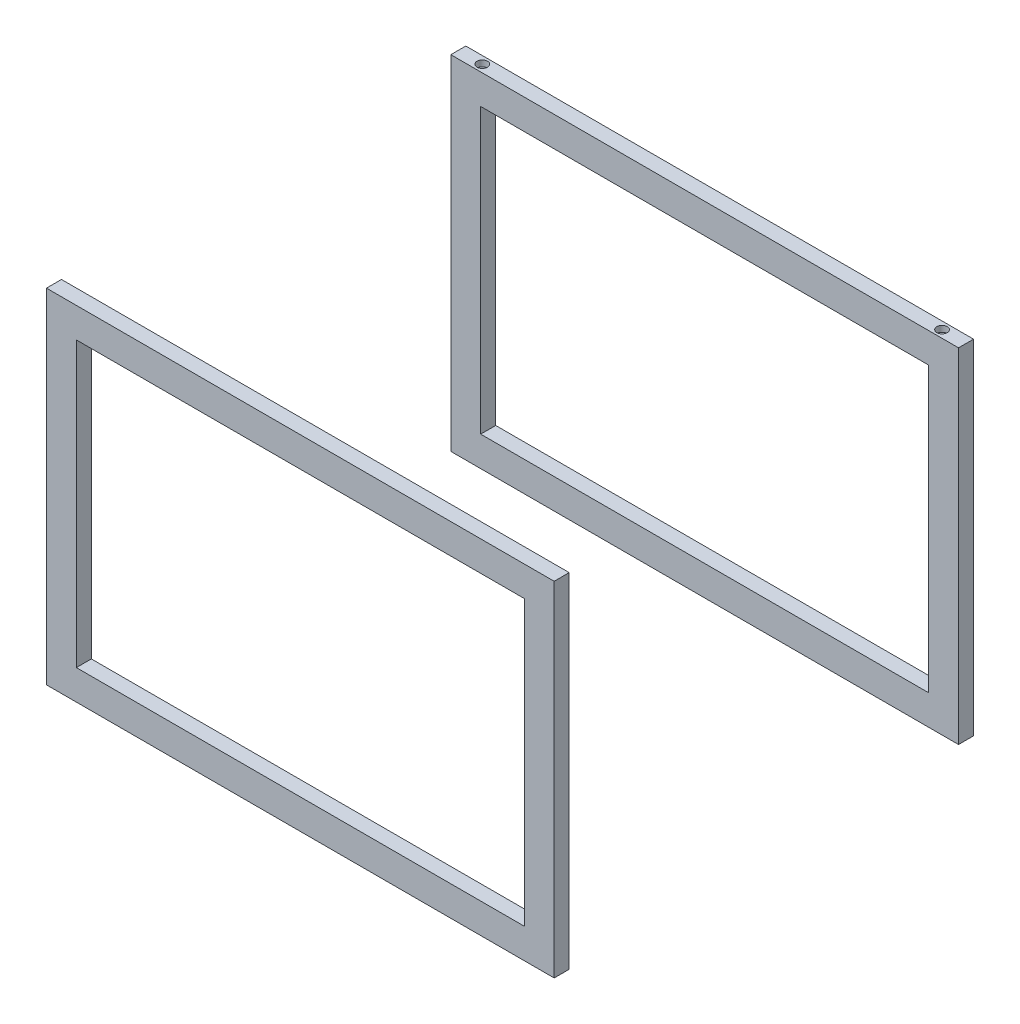
ISO-10303-21;
HEADER;
FILE_DESCRIPTION(('STEP AP214'),'2;1');
FILE_NAME('part.step','',(''),(''),'','','');
FILE_SCHEMA(('AUTOMOTIVE_DESIGN { 1 0 10303 214 1 1 1 1 }'));
ENDSEC;
DATA;
#1=APPLICATION_CONTEXT('core data for automotive mechanical design processes');
#2=APPLICATION_PROTOCOL_DEFINITION('international standard','automotive_design',2000,#1);
#3=PRODUCT_CONTEXT('',#1,'mechanical');
#4=PRODUCT('Part','Part','',(#3));
#5=PRODUCT_RELATED_PRODUCT_CATEGORY('part','',(#4));
#6=PRODUCT_DEFINITION_FORMATION('','',#4);
#7=PRODUCT_DEFINITION_CONTEXT('part definition',#1,'design');
#8=PRODUCT_DEFINITION('design','',#6,#7);
#9=PRODUCT_DEFINITION_SHAPE('','',#8);
#10=(LENGTH_UNIT() NAMED_UNIT(*) SI_UNIT(.MILLI.,.METRE.));
#11=(NAMED_UNIT(*) PLANE_ANGLE_UNIT() SI_UNIT($,.RADIAN.));
#12=(NAMED_UNIT(*) SI_UNIT($,.STERADIAN.) SOLID_ANGLE_UNIT());
#13=UNCERTAINTY_MEASURE_WITH_UNIT(LENGTH_MEASURE(1.E-05),#10,'distance_accuracy_value','');
#14=(GEOMETRIC_REPRESENTATION_CONTEXT(3) GLOBAL_UNCERTAINTY_ASSIGNED_CONTEXT((#13)) GLOBAL_UNIT_ASSIGNED_CONTEXT((#10,
#11,#12)) REPRESENTATION_CONTEXT('',''));
#15=CARTESIAN_POINT('',(0.,0.,0.));
#16=DIRECTION('',(0.,0.,1.));
#17=DIRECTION('',(1.,0.,0.));
#18=AXIS2_PLACEMENT_3D('',#15,#16,#17);
#19=CARTESIAN_POINT('',(99.8100000000002,0.,1349.87));
#20=DIRECTION('',(-1.,0.,0.));
#21=DIRECTION('',(0.,-1.,0.));
#22=AXIS2_PLACEMENT_3D('',#19,#20,#21);
#23=PLANE('',#22);
#24=DIRECTION('',(0.,-1.,0.));
#25=VECTOR('',#24,1.);
#26=CARTESIAN_POINT('',(99.8100000000002,0.,1400.));
#27=LINE('',#26,#25);
#28=CARTESIAN_POINT('',(99.8100000000002,1047.19,1400.));
#29=VERTEX_POINT('',#28);
#30=CARTESIAN_POINT('',(99.8100000000001,99.81,1400.));
#31=VERTEX_POINT('',#30);
#32=EDGE_CURVE('E168',#29,#31,#27,.T.);
#33=ORIENTED_EDGE('',*,*,#32,.T.);
#34=DIRECTION('',(0.,0.,1.));
#35=VECTOR('',#34,1.);
#36=CARTESIAN_POINT('',(99.8100000000001,99.81,1349.87));
#37=LINE('',#36,#35);
#38=CARTESIAN_POINT('',(99.8100000000001,99.81,1349.87));
#39=VERTEX_POINT('',#38);
#40=EDGE_CURVE('E12',#39,#31,#37,.T.);
#41=ORIENTED_EDGE('',*,*,#40,.F.);
#42=DIRECTION('',(0.,-1.,0.));
#43=VECTOR('',#42,1.);
#44=CARTESIAN_POINT('',(99.81,0.,1349.87));
#45=LINE('',#44,#43);
#46=CARTESIAN_POINT('',(99.8100000000002,1047.19,1349.87));
#47=VERTEX_POINT('',#46);
#48=EDGE_CURVE('E142',#47,#39,#45,.T.);
#49=ORIENTED_EDGE('',*,*,#48,.F.);
#50=DIRECTION('',(0.,0.,1.));
#51=VECTOR('',#50,1.);
#52=CARTESIAN_POINT('',(99.8100000000002,1047.19,1349.87));
#53=LINE('',#52,#51);
#54=EDGE_CURVE('E134',#47,#29,#53,.T.);
#55=ORIENTED_EDGE('',*,*,#54,.T.);
#56=EDGE_LOOP('',(#33,#41,#49,#55));
#57=FACE_BOUND('',#56,.T.);
#58=ADVANCED_FACE('F53',(#57),#23,.F.);
#59=CARTESIAN_POINT('',(0.,99.81,1349.87));
#60=DIRECTION('',(0.,1.,0.));
#61=DIRECTION('',(0.,0.,1.));
#62=AXIS2_PLACEMENT_3D('',#59,#60,#61);
#63=PLANE('',#62);
#64=DIRECTION('',(-1.,0.,0.));
#65=VECTOR('',#64,1.);
#66=CARTESIAN_POINT('',(0.,99.81,1400.));
#67=LINE('',#66,#65);
#68=CARTESIAN_POINT('',(1595.19,99.81,1400.));
#69=VERTEX_POINT('',#68);
#70=EDGE_CURVE('E97',#69,#31,#67,.T.);
#71=ORIENTED_EDGE('',*,*,#70,.F.);
#72=DIRECTION('',(0.,0.,1.));
#73=VECTOR('',#72,1.);
#74=CARTESIAN_POINT('',(1595.19,99.81,1349.87));
#75=LINE('',#74,#73);
#76=CARTESIAN_POINT('',(1595.19,99.81,1349.87));
#77=VERTEX_POINT('',#76);
#78=EDGE_CURVE('E63',#77,#69,#75,.T.);
#79=ORIENTED_EDGE('',*,*,#78,.F.);
#80=DIRECTION('',(-1.,0.,0.));
#81=VECTOR('',#80,1.);
#82=CARTESIAN_POINT('',(0.,99.81,1349.87));
#83=LINE('',#82,#81);
#84=EDGE_CURVE('E71',#77,#39,#83,.T.);
#85=ORIENTED_EDGE('',*,*,#84,.T.);
#86=ORIENTED_EDGE('',*,*,#40,.T.);
#87=EDGE_LOOP('',(#71,#79,#85,#86));
#88=FACE_BOUND('',#87,.T.);
#89=ADVANCED_FACE('F209',(#88),#63,.T.);
#90=CARTESIAN_POINT('',(0.,1047.19,1349.87));
#91=DIRECTION('',(0.,1.,0.));
#92=DIRECTION('',(0.,0.,1.));
#93=AXIS2_PLACEMENT_3D('',#90,#91,#92);
#94=PLANE('',#93);
#95=DIRECTION('',(-1.,0.,0.));
#96=VECTOR('',#95,1.);
#97=CARTESIAN_POINT('',(0.,1047.19,1400.));
#98=LINE('',#97,#96);
#99=CARTESIAN_POINT('',(1595.19,1047.19,1400.));
#100=VERTEX_POINT('',#99);
#101=EDGE_CURVE('E165',#100,#29,#98,.T.);
#102=ORIENTED_EDGE('',*,*,#101,.T.);
#103=ORIENTED_EDGE('',*,*,#54,.F.);
#104=DIRECTION('',(-1.,0.,0.));
#105=VECTOR('',#104,1.);
#106=CARTESIAN_POINT('',(0.,1047.19,1349.87));
#107=LINE('',#106,#105);
#108=CARTESIAN_POINT('',(1595.19,1047.19,1349.87));
#109=VERTEX_POINT('',#108);
#110=EDGE_CURVE('E138',#109,#47,#107,.T.);
#111=ORIENTED_EDGE('',*,*,#110,.F.);
#112=DIRECTION('',(0.,0.,1.));
#113=VECTOR('',#112,1.);
#114=CARTESIAN_POINT('',(1595.19,1047.19,1349.87));
#115=LINE('',#114,#113);
#116=EDGE_CURVE('E124',#109,#100,#115,.T.);
#117=ORIENTED_EDGE('',*,*,#116,.T.);
#118=EDGE_LOOP('',(#102,#103,#111,#117));
#119=FACE_BOUND('',#118,.T.);
#120=ADVANCED_FACE('F139',(#119),#94,.F.);
#121=CARTESIAN_POINT('',(0.,0.,1349.87));
#122=DIRECTION('',(-1.,0.,0.));
#123=DIRECTION('',(0.,0.,1.));
#124=AXIS2_PLACEMENT_3D('',#121,#122,#123);
#125=PLANE('',#124);
#126=DIRECTION('',(0.,-1.,0.));
#127=VECTOR('',#126,1.);
#128=CARTESIAN_POINT('',(0.,0.,1400.));
#129=LINE('',#128,#127);
#130=CARTESIAN_POINT('',(0.,1147.,1400.));
#131=VERTEX_POINT('',#130);
#132=CARTESIAN_POINT('',(0.,0.,1400.));
#133=VERTEX_POINT('',#132);
#134=EDGE_CURVE('E153',#131,#133,#129,.T.);
#135=ORIENTED_EDGE('',*,*,#134,.F.);
#136=DIRECTION('',(0.,0.,1.));
#137=VECTOR('',#136,1.);
#138=CARTESIAN_POINT('',(0.,1147.,1349.87));
#139=LINE('',#138,#137);
#140=CARTESIAN_POINT('',(0.,1147.,1349.87));
#141=VERTEX_POINT('',#140);
#142=EDGE_CURVE('E57',#141,#131,#139,.T.);
#143=ORIENTED_EDGE('',*,*,#142,.F.);
#144=DIRECTION('',(0.,-1.,0.));
#145=VECTOR('',#144,1.);
#146=CARTESIAN_POINT('',(0.,0.,1349.87));
#147=LINE('',#146,#145);
#148=CARTESIAN_POINT('',(0.,0.,1349.87));
#149=VERTEX_POINT('',#148);
#150=EDGE_CURVE('E195',#141,#149,#147,.T.);
#151=ORIENTED_EDGE('',*,*,#150,.T.);
#152=DIRECTION('',(0.,0.,1.));
#153=VECTOR('',#152,1.);
#154=CARTESIAN_POINT('',(0.,0.,1349.87));
#155=LINE('',#154,#153);
#156=EDGE_CURVE('E147',#149,#133,#155,.T.);
#157=ORIENTED_EDGE('',*,*,#156,.T.);
#158=EDGE_LOOP('',(#135,#143,#151,#157));
#159=FACE_BOUND('',#158,.T.);
#160=ADVANCED_FACE('F55',(#159),#125,.T.);
#161=CARTESIAN_POINT('',(0.,1147.,1349.87));
#162=DIRECTION('',(0.,1.,0.));
#163=DIRECTION('',(0.,0.,1.));
#164=AXIS2_PLACEMENT_3D('',#161,#162,#163);
#165=PLANE('',#164);
#166=DIRECTION('',(-1.,0.,0.));
#167=VECTOR('',#166,1.);
#168=CARTESIAN_POINT('',(0.,1147.,1400.));
#169=LINE('',#168,#167);
#170=CARTESIAN_POINT('',(1695.,1147.,1400.));
#171=VERTEX_POINT('',#170);
#172=EDGE_CURVE('E156',#171,#131,#169,.T.);
#173=ORIENTED_EDGE('',*,*,#172,.F.);
#174=DIRECTION('',(0.,0.,1.));
#175=VECTOR('',#174,1.);
#176=CARTESIAN_POINT('',(1695.,1147.,1349.87));
#177=LINE('',#176,#175);
#178=CARTESIAN_POINT('',(1695.,1147.,1349.87));
#179=VERTEX_POINT('',#178);
#180=EDGE_CURVE('E174',#179,#171,#177,.T.);
#181=ORIENTED_EDGE('',*,*,#180,.F.);
#182=DIRECTION('',(-1.,0.,0.));
#183=VECTOR('',#182,1.);
#184=CARTESIAN_POINT('',(0.,1147.,1349.87));
#185=LINE('',#184,#183);
#186=EDGE_CURVE('E183',#179,#141,#185,.T.);
#187=ORIENTED_EDGE('',*,*,#186,.T.);
#188=ORIENTED_EDGE('',*,*,#142,.T.);
#189=EDGE_LOOP('',(#173,#181,#187,#188));
#190=FACE_BOUND('',#189,.T.);
#191=ADVANCED_FACE('F181',(#190),#165,.T.);
#192=CARTESIAN_POINT('',(1695.,0.,1349.87));
#193=DIRECTION('',(-1.,0.,0.));
#194=DIRECTION('',(0.,0.,1.));
#195=AXIS2_PLACEMENT_3D('',#192,#193,#194);
#196=PLANE('',#195);
#197=DIRECTION('',(0.,-1.,0.));
#198=VECTOR('',#197,1.);
#199=CARTESIAN_POINT('',(1695.,0.,1400.));
#200=LINE('',#199,#198);
#201=CARTESIAN_POINT('',(1695.,0.,1400.));
#202=VERTEX_POINT('',#201);
#203=EDGE_CURVE('E159',#171,#202,#200,.T.);
#204=ORIENTED_EDGE('',*,*,#203,.T.);
#205=DIRECTION('',(0.,0.,1.));
#206=VECTOR('',#205,1.);
#207=CARTESIAN_POINT('',(1695.,0.,1349.87));
#208=LINE('',#207,#206);
#209=CARTESIAN_POINT('',(1695.,0.,1349.87));
#210=VERTEX_POINT('',#209);
#211=EDGE_CURVE('E149',#210,#202,#208,.T.);
#212=ORIENTED_EDGE('',*,*,#211,.F.);
#213=DIRECTION('',(0.,-1.,0.));
#214=VECTOR('',#213,1.);
#215=CARTESIAN_POINT('',(1695.,0.,1349.87));
#216=LINE('',#215,#214);
#217=EDGE_CURVE('E190',#179,#210,#216,.T.);
#218=ORIENTED_EDGE('',*,*,#217,.F.);
#219=ORIENTED_EDGE('',*,*,#180,.T.);
#220=EDGE_LOOP('',(#204,#212,#218,#219));
#221=FACE_BOUND('',#220,.T.);
#222=ADVANCED_FACE('F188',(#221),#196,.F.);
#223=CARTESIAN_POINT('',(1595.19,9.07771427587485E-13,1349.87));
#224=DIRECTION('',(-1.,0.,0.));
#225=DIRECTION('',(0.,-1.,0.));
#226=AXIS2_PLACEMENT_3D('',#223,#224,#225);
#227=PLANE('',#226);
#228=DIRECTION('',(0.,-1.,0.));
#229=VECTOR('',#228,1.);
#230=CARTESIAN_POINT('',(1595.19,9.07771427587485E-13,1400.));
#231=LINE('',#230,#229);
#232=EDGE_CURVE('E130',#100,#69,#231,.T.);
#233=ORIENTED_EDGE('',*,*,#232,.F.);
#234=ORIENTED_EDGE('',*,*,#116,.F.);
#235=DIRECTION('',(0.,-1.,0.));
#236=VECTOR('',#235,1.);
#237=CARTESIAN_POINT('',(1595.19,0.,1349.87));
#238=LINE('',#237,#236);
#239=EDGE_CURVE('E128',#109,#77,#238,.T.);
#240=ORIENTED_EDGE('',*,*,#239,.T.);
#241=ORIENTED_EDGE('',*,*,#78,.T.);
#242=EDGE_LOOP('',(#233,#234,#240,#241));
#243=FACE_BOUND('',#242,.T.);
#244=ADVANCED_FACE('F126',(#243),#227,.T.);
#245=CARTESIAN_POINT('',(0.,0.,1349.87));
#246=DIRECTION('',(0.,1.,0.));
#247=DIRECTION('',(0.,0.,1.));
#248=AXIS2_PLACEMENT_3D('',#245,#246,#247);
#249=PLANE('',#248);
#250=DIRECTION('',(-1.,0.,0.));
#251=VECTOR('',#250,1.);
#252=CARTESIAN_POINT('',(0.,0.,1400.));
#253=LINE('',#252,#251);
#254=EDGE_CURVE('E162',#202,#133,#253,.T.);
#255=ORIENTED_EDGE('',*,*,#254,.T.);
#256=ORIENTED_EDGE('',*,*,#156,.F.);
#257=DIRECTION('',(-1.,0.,0.));
#258=VECTOR('',#257,1.);
#259=CARTESIAN_POINT('',(0.,0.,1349.87));
#260=LINE('',#259,#258);
#261=EDGE_CURVE('E143',#210,#149,#260,.T.);
#262=ORIENTED_EDGE('',*,*,#261,.F.);
#263=ORIENTED_EDGE('',*,*,#211,.T.);
#264=EDGE_LOOP('',(#255,#256,#262,#263));
#265=FACE_BOUND('',#264,.T.);
#266=ADVANCED_FACE('F192',(#265),#249,.F.);
#267=CARTESIAN_POINT('',(0.,0.,1349.87));
#268=DIRECTION('',(0.,0.,-1.));
#269=DIRECTION('',(-1.,0.,0.));
#270=AXIS2_PLACEMENT_3D('',#267,#268,#269);
#271=PLANE('',#270);
#272=ORIENTED_EDGE('',*,*,#84,.F.);
#273=ORIENTED_EDGE('',*,*,#239,.F.);
#274=ORIENTED_EDGE('',*,*,#110,.T.);
#275=ORIENTED_EDGE('',*,*,#48,.T.);
#276=EDGE_LOOP('',(#272,#273,#274,#275));
#277=FACE_BOUND('',#276,.T.);
#278=ORIENTED_EDGE('',*,*,#150,.F.);
#279=ORIENTED_EDGE('',*,*,#186,.F.);
#280=ORIENTED_EDGE('',*,*,#217,.T.);
#281=ORIENTED_EDGE('',*,*,#261,.T.);
#282=EDGE_LOOP('',(#278,#279,#280,#281));
#283=FACE_BOUND('',#282,.T.);
#284=ADVANCED_FACE('F145',(#277,#283),#271,.T.);
#285=CARTESIAN_POINT('',(0.,0.,1400.));
#286=DIRECTION('',(0.,0.,-1.));
#287=DIRECTION('',(-1.,0.,0.));
#288=AXIS2_PLACEMENT_3D('',#285,#286,#287);
#289=PLANE('',#288);
#290=ORIENTED_EDGE('',*,*,#232,.T.);
#291=ORIENTED_EDGE('',*,*,#70,.T.);
#292=ORIENTED_EDGE('',*,*,#32,.F.);
#293=ORIENTED_EDGE('',*,*,#101,.F.);
#294=EDGE_LOOP('',(#290,#291,#292,#293));
#295=FACE_BOUND('',#294,.T.);
#296=ORIENTED_EDGE('',*,*,#134,.T.);
#297=ORIENTED_EDGE('',*,*,#254,.F.);
#298=ORIENTED_EDGE('',*,*,#203,.F.);
#299=ORIENTED_EDGE('',*,*,#172,.T.);
#300=EDGE_LOOP('',(#296,#297,#298,#299));
#301=FACE_BOUND('',#300,.T.);
#302=ADVANCED_FACE('F186',(#295,#301),#289,.F.);
#303=CLOSED_SHELL('',(#58,#89,#120,#160,#191,#222,#244,#266,#284,#302));
#304=MANIFOLD_SOLID_BREP('B2_NOT_SHOWN',#303);
#305=CARTESIAN_POINT('',(0.,0.,50.13));
#306=DIRECTION('',(0.,0.,-1.));
#307=DIRECTION('',(-1.,0.,0.));
#308=AXIS2_PLACEMENT_3D('',#305,#306,#307);
#309=PLANE('',#308);
#310=DIRECTION('',(0.,-1.,0.));
#311=VECTOR('',#310,1.);
#312=CARTESIAN_POINT('',(0.,0.,50.13));
#313=LINE('',#312,#311);
#314=CARTESIAN_POINT('',(0.,1147.,50.13));
#315=VERTEX_POINT('',#314);
#316=CARTESIAN_POINT('',(0.,0.,50.13));
#317=VERTEX_POINT('',#316);
#318=EDGE_CURVE('E437',#315,#317,#313,.T.);
#319=ORIENTED_EDGE('',*,*,#318,.T.);
#320=DIRECTION('',(1.,0.,0.));
#321=VECTOR('',#320,1.);
#322=CARTESIAN_POINT('',(0.,0.,50.13));
#323=LINE('',#322,#321);
#324=CARTESIAN_POINT('',(1695.,0.,50.13));
#325=VERTEX_POINT('',#324);
#326=EDGE_CURVE('E440',#317,#325,#323,.T.);
#327=ORIENTED_EDGE('',*,*,#326,.T.);
#328=DIRECTION('',(0.,1.,0.));
#329=VECTOR('',#328,1.);
#330=CARTESIAN_POINT('',(1695.,0.,50.13));
#331=LINE('',#330,#329);
#332=CARTESIAN_POINT('',(1695.,1147.,50.13));
#333=VERTEX_POINT('',#332);
#334=EDGE_CURVE('E443',#325,#333,#331,.T.);
#335=ORIENTED_EDGE('',*,*,#334,.T.);
#336=DIRECTION('',(-1.,0.,0.));
#337=VECTOR('',#336,1.);
#338=CARTESIAN_POINT('',(0.,1147.,50.13));
#339=LINE('',#338,#337);
#340=EDGE_CURVE('E445',#333,#315,#339,.T.);
#341=ORIENTED_EDGE('',*,*,#340,.T.);
#342=EDGE_LOOP('',(#319,#327,#335,#341));
#343=FACE_BOUND('',#342,.T.);
#344=DIRECTION('',(1.,0.,0.));
#345=VECTOR('',#344,1.);
#346=CARTESIAN_POINT('',(99.8100000000001,99.81,50.13));
#347=LINE('',#346,#345);
#348=CARTESIAN_POINT('',(99.8100000000001,99.81,50.13));
#349=VERTEX_POINT('',#348);
#350=CARTESIAN_POINT('',(1595.19,99.81,50.13));
#351=VERTEX_POINT('',#350);
#352=EDGE_CURVE('E417',#349,#351,#347,.T.);
#353=ORIENTED_EDGE('',*,*,#352,.F.);
#354=DIRECTION('',(0.,-1.,0.));
#355=VECTOR('',#354,1.);
#356=CARTESIAN_POINT('',(99.81,1047.19,50.13));
#357=LINE('',#356,#355);
#358=CARTESIAN_POINT('',(99.81,1047.19,50.13));
#359=VERTEX_POINT('',#358);
#360=EDGE_CURVE('E409',#359,#349,#357,.T.);
#361=ORIENTED_EDGE('',*,*,#360,.F.);
#362=DIRECTION('',(-1.,0.,0.));
#363=VECTOR('',#362,1.);
#364=CARTESIAN_POINT('',(99.81,1047.19,50.13));
#365=LINE('',#364,#363);
#366=CARTESIAN_POINT('',(1595.19,1047.19,50.13));
#367=VERTEX_POINT('',#366);
#368=EDGE_CURVE('E429',#367,#359,#365,.T.);
#369=ORIENTED_EDGE('',*,*,#368,.F.);
#370=DIRECTION('',(0.,1.,0.));
#371=VECTOR('',#370,1.);
#372=CARTESIAN_POINT('',(1595.19,1047.19,50.13));
#373=LINE('',#372,#371);
#374=EDGE_CURVE('E427',#351,#367,#373,.T.);
#375=ORIENTED_EDGE('',*,*,#374,.F.);
#376=EDGE_LOOP('',(#353,#361,#369,#375));
#377=FACE_BOUND('',#376,.T.);
#378=ADVANCED_FACE('F330',(#343,#377),#309,.F.);
#379=CARTESIAN_POINT('',(0.,0.,0.));
#380=DIRECTION('',(0.,0.,-1.));
#381=DIRECTION('',(-1.,0.,0.));
#382=AXIS2_PLACEMENT_3D('',#379,#380,#381);
#383=PLANE('',#382);
#384=DIRECTION('',(0.,-1.,0.));
#385=VECTOR('',#384,1.);
#386=CARTESIAN_POINT('',(99.81,1047.19,0.));
#387=LINE('',#386,#385);
#388=CARTESIAN_POINT('',(99.81,1047.19,0.));
#389=VERTEX_POINT('',#388);
#390=CARTESIAN_POINT('',(99.8100000000001,99.81,0.));
#391=VERTEX_POINT('',#390);
#392=EDGE_CURVE('E353',#389,#391,#387,.T.);
#393=ORIENTED_EDGE('',*,*,#392,.T.);
#394=DIRECTION('',(1.,0.,0.));
#395=VECTOR('',#394,1.);
#396=CARTESIAN_POINT('',(99.8100000000001,99.81,0.));
#397=LINE('',#396,#395);
#398=CARTESIAN_POINT('',(1595.19,99.81,0.));
#399=VERTEX_POINT('',#398);
#400=EDGE_CURVE('E400',#391,#399,#397,.T.);
#401=ORIENTED_EDGE('',*,*,#400,.T.);
#402=DIRECTION('',(0.,1.,0.));
#403=VECTOR('',#402,1.);
#404=CARTESIAN_POINT('',(1595.19,1047.19,0.));
#405=LINE('',#404,#403);
#406=CARTESIAN_POINT('',(1595.19,1047.19,0.));
#407=VERTEX_POINT('',#406);
#408=EDGE_CURVE('E402',#399,#407,#405,.T.);
#409=ORIENTED_EDGE('',*,*,#408,.T.);
#410=DIRECTION('',(-1.,0.,0.));
#411=VECTOR('',#410,1.);
#412=CARTESIAN_POINT('',(99.81,1047.19,0.));
#413=LINE('',#412,#411);
#414=EDGE_CURVE('E401',#407,#389,#413,.T.);
#415=ORIENTED_EDGE('',*,*,#414,.T.);
#416=EDGE_LOOP('',(#393,#401,#409,#415));
#417=FACE_BOUND('',#416,.T.);
#418=DIRECTION('',(0.,-1.,0.));
#419=VECTOR('',#418,1.);
#420=CARTESIAN_POINT('',(0.,0.,0.));
#421=LINE('',#420,#419);
#422=CARTESIAN_POINT('',(0.,1147.,0.));
#423=VERTEX_POINT('',#422);
#424=CARTESIAN_POINT('',(0.,0.,0.));
#425=VERTEX_POINT('',#424);
#426=EDGE_CURVE('E436',#423,#425,#421,.T.);
#427=ORIENTED_EDGE('',*,*,#426,.F.);
#428=DIRECTION('',(-1.,0.,0.));
#429=VECTOR('',#428,1.);
#430=CARTESIAN_POINT('',(0.,1147.,0.));
#431=LINE('',#430,#429);
#432=CARTESIAN_POINT('',(1695.,1147.,0.));
#433=VERTEX_POINT('',#432);
#434=EDGE_CURVE('E441',#433,#423,#431,.T.);
#435=ORIENTED_EDGE('',*,*,#434,.F.);
#436=DIRECTION('',(0.,1.,0.));
#437=VECTOR('',#436,1.);
#438=CARTESIAN_POINT('',(1695.,0.,0.));
#439=LINE('',#438,#437);
#440=CARTESIAN_POINT('',(1695.,0.,0.));
#441=VERTEX_POINT('',#440);
#442=EDGE_CURVE('E452',#441,#433,#439,.T.);
#443=ORIENTED_EDGE('',*,*,#442,.F.);
#444=DIRECTION('',(1.,0.,0.));
#445=VECTOR('',#444,1.);
#446=CARTESIAN_POINT('',(0.,0.,0.));
#447=LINE('',#446,#445);
#448=EDGE_CURVE('E450',#425,#441,#447,.T.);
#449=ORIENTED_EDGE('',*,*,#448,.F.);
#450=EDGE_LOOP('',(#427,#435,#443,#449));
#451=FACE_BOUND('',#450,.T.);
#452=ADVANCED_FACE('F396',(#417,#451),#383,.T.);
#453=CARTESIAN_POINT('',(0.,0.,50.13));
#454=DIRECTION('',(1.,0.,0.));
#455=DIRECTION('',(0.,0.,-1.));
#456=AXIS2_PLACEMENT_3D('',#453,#454,#455);
#457=PLANE('',#456);
#458=ORIENTED_EDGE('',*,*,#426,.T.);
#459=DIRECTION('',(0.,0.,-1.));
#460=VECTOR('',#459,1.);
#461=CARTESIAN_POINT('',(0.,0.,50.13));
#462=LINE('',#461,#460);
#463=EDGE_CURVE('E51',#317,#425,#462,.T.);
#464=ORIENTED_EDGE('',*,*,#463,.F.);
#465=ORIENTED_EDGE('',*,*,#318,.F.);
#466=DIRECTION('',(0.,0.,-1.));
#467=VECTOR('',#466,1.);
#468=CARTESIAN_POINT('',(0.,1147.,50.13));
#469=LINE('',#468,#467);
#470=EDGE_CURVE('E447',#315,#423,#469,.T.);
#471=ORIENTED_EDGE('',*,*,#470,.T.);
#472=EDGE_LOOP('',(#458,#464,#465,#471));
#473=FACE_BOUND('',#472,.T.);
#474=ADVANCED_FACE('F332',(#473),#457,.F.);
#475=CARTESIAN_POINT('',(0.,0.,50.13));
#476=DIRECTION('',(0.,1.,0.));
#477=DIRECTION('',(0.,0.,1.));
#478=AXIS2_PLACEMENT_3D('',#475,#476,#477);
#479=PLANE('',#478);
#480=ORIENTED_EDGE('',*,*,#448,.T.);
#481=DIRECTION('',(0.,0.,-1.));
#482=VECTOR('',#481,1.);
#483=CARTESIAN_POINT('',(1695.,0.,50.13));
#484=LINE('',#483,#482);
#485=EDGE_CURVE('E338',#325,#441,#484,.T.);
#486=ORIENTED_EDGE('',*,*,#485,.F.);
#487=ORIENTED_EDGE('',*,*,#326,.F.);
#488=ORIENTED_EDGE('',*,*,#463,.T.);
#489=EDGE_LOOP('',(#480,#486,#487,#488));
#490=FACE_BOUND('',#489,.T.);
#491=ADVANCED_FACE('F478',(#490),#479,.F.);
#492=CARTESIAN_POINT('',(1695.,0.,50.13));
#493=DIRECTION('',(-1.,0.,0.));
#494=DIRECTION('',(0.,0.,1.));
#495=AXIS2_PLACEMENT_3D('',#492,#493,#494);
#496=PLANE('',#495);
#497=ORIENTED_EDGE('',*,*,#442,.T.);
#498=DIRECTION('',(0.,0.,-1.));
#499=VECTOR('',#498,1.);
#500=CARTESIAN_POINT('',(1695.,1147.,50.13));
#501=LINE('',#500,#499);
#502=EDGE_CURVE('E457',#333,#433,#501,.T.);
#503=ORIENTED_EDGE('',*,*,#502,.F.);
#504=ORIENTED_EDGE('',*,*,#334,.F.);
#505=ORIENTED_EDGE('',*,*,#485,.T.);
#506=EDGE_LOOP('',(#497,#503,#504,#505));
#507=FACE_BOUND('',#506,.T.);
#508=ADVANCED_FACE('F464',(#507),#496,.F.);
#509=CARTESIAN_POINT('',(0.,1147.,50.13));
#510=DIRECTION('',(0.,-1.,0.));
#511=DIRECTION('',(0.,0.,-1.));
#512=AXIS2_PLACEMENT_3D('',#509,#510,#511);
#513=PLANE('',#512);
#514=CARTESIAN_POINT('',(1615.,1147.,25.065));
#515=DIRECTION('',(0.,1.,0.));
#516=DIRECTION('',(0.,0.,1.));
#517=AXIS2_PLACEMENT_3D('',#514,#515,#516);
#518=CIRCLE('',#517,17.5000000000001);
#519=CARTESIAN_POINT('',(1615.,1147.,42.5650000000001));
#520=VERTEX_POINT('',#519);
#521=EDGE_CURVE('E503',#520,#520,#518,.T.);
#522=ORIENTED_EDGE('',*,*,#521,.F.);
#523=EDGE_LOOP('',(#522));
#524=FACE_BOUND('',#523,.T.);
#525=CARTESIAN_POINT('',(80.0000000000001,1147.,25.065));
#526=DIRECTION('',(0.,1.,0.));
#527=DIRECTION('',(0.,0.,-1.));
#528=AXIS2_PLACEMENT_3D('',#525,#526,#527);
#529=CIRCLE('',#528,17.5000000000001);
#530=CARTESIAN_POINT('',(80.0000000000001,1147.,7.56499999999996));
#531=VERTEX_POINT('',#530);
#532=EDGE_CURVE('E506',#531,#531,#529,.T.);
#533=ORIENTED_EDGE('',*,*,#532,.F.);
#534=EDGE_LOOP('',(#533));
#535=FACE_BOUND('',#534,.T.);
#536=ORIENTED_EDGE('',*,*,#434,.T.);
#537=ORIENTED_EDGE('',*,*,#470,.F.);
#538=ORIENTED_EDGE('',*,*,#340,.F.);
#539=ORIENTED_EDGE('',*,*,#502,.T.);
#540=EDGE_LOOP('',(#536,#537,#538,#539));
#541=FACE_BOUND('',#540,.T.);
#542=ADVANCED_FACE('F471',(#524,#535,#541),#513,.F.);
#543=CARTESIAN_POINT('',(99.81,1047.19,50.13));
#544=DIRECTION('',(1.,0.,0.));
#545=DIRECTION('',(0.,1.,0.));
#546=AXIS2_PLACEMENT_3D('',#543,#544,#545);
#547=PLANE('',#546);
#548=ORIENTED_EDGE('',*,*,#392,.F.);
#549=DIRECTION('',(0.,0.,-1.));
#550=VECTOR('',#549,1.);
#551=CARTESIAN_POINT('',(99.81,1047.19,50.13));
#552=LINE('',#551,#550);
#553=EDGE_CURVE('E430',#359,#389,#552,.T.);
#554=ORIENTED_EDGE('',*,*,#553,.F.);
#555=ORIENTED_EDGE('',*,*,#360,.T.);
#556=DIRECTION('',(0.,0.,1.));
#557=VECTOR('',#556,1.);
#558=CARTESIAN_POINT('',(99.8100000000001,99.81,0.));
#559=LINE('',#558,#557);
#560=EDGE_CURVE('E406',#391,#349,#559,.T.);
#561=ORIENTED_EDGE('',*,*,#560,.F.);
#562=EDGE_LOOP('',(#548,#554,#555,#561));
#563=FACE_BOUND('',#562,.T.);
#564=ADVANCED_FACE('F407',(#563),#547,.T.);
#565=CARTESIAN_POINT('',(1595.19,1047.19,50.13));
#566=DIRECTION('',(-1.,0.,0.));
#567=DIRECTION('',(0.,0.,1.));
#568=AXIS2_PLACEMENT_3D('',#565,#566,#567);
#569=PLANE('',#568);
#570=ORIENTED_EDGE('',*,*,#408,.F.);
#571=DIRECTION('',(0.,0.,1.));
#572=VECTOR('',#571,1.);
#573=CARTESIAN_POINT('',(1595.19,99.81,0.));
#574=LINE('',#573,#572);
#575=EDGE_CURVE('E403',#399,#351,#574,.T.);
#576=ORIENTED_EDGE('',*,*,#575,.T.);
#577=ORIENTED_EDGE('',*,*,#374,.T.);
#578=DIRECTION('',(0.,0.,-1.));
#579=VECTOR('',#578,1.);
#580=CARTESIAN_POINT('',(1595.19,1047.19,50.13));
#581=LINE('',#580,#579);
#582=EDGE_CURVE('E345',#367,#407,#581,.T.);
#583=ORIENTED_EDGE('',*,*,#582,.T.);
#584=EDGE_LOOP('',(#570,#576,#577,#583));
#585=FACE_BOUND('',#584,.T.);
#586=ADVANCED_FACE('F499',(#585),#569,.T.);
#587=CARTESIAN_POINT('',(99.81,1047.19,50.13));
#588=DIRECTION('',(0.,-1.,0.));
#589=DIRECTION('',(0.,0.,-1.));
#590=AXIS2_PLACEMENT_3D('',#587,#588,#589);
#591=PLANE('',#590);
#592=ORIENTED_EDGE('',*,*,#414,.F.);
#593=ORIENTED_EDGE('',*,*,#582,.F.);
#594=ORIENTED_EDGE('',*,*,#368,.T.);
#595=ORIENTED_EDGE('',*,*,#553,.T.);
#596=EDGE_LOOP('',(#592,#593,#594,#595));
#597=FACE_BOUND('',#596,.T.);
#598=ADVANCED_FACE('F535',(#597),#591,.T.);
#599=CARTESIAN_POINT('',(99.8100000000001,99.81,0.));
#600=DIRECTION('',(0.,-1.,0.));
#601=DIRECTION('',(0.,0.,-1.));
#602=AXIS2_PLACEMENT_3D('',#599,#600,#601);
#603=PLANE('',#602);
#604=ORIENTED_EDGE('',*,*,#352,.T.);
#605=ORIENTED_EDGE('',*,*,#575,.F.);
#606=ORIENTED_EDGE('',*,*,#400,.F.);
#607=ORIENTED_EDGE('',*,*,#560,.T.);
#608=EDGE_LOOP('',(#604,#605,#606,#607));
#609=FACE_BOUND('',#608,.T.);
#610=ADVANCED_FACE('F415',(#609),#603,.F.);
#611=CARTESIAN_POINT('',(80.0000000000001,1127.,25.065));
#612=DIRECTION('',(0.,1.,0.));
#613=DIRECTION('',(0.,0.,1.));
#614=AXIS2_PLACEMENT_3D('',#611,#612,#613);
#615=CYLINDRICAL_SURFACE('',#614,17.5000000000001);
#616=CARTESIAN_POINT('',(80.0000000000001,1127.,25.065));
#617=DIRECTION('',(0.,1.,0.));
#618=DIRECTION('',(0.,0.,-1.));
#619=AXIS2_PLACEMENT_3D('',#616,#617,#618);
#620=CIRCLE('',#619,17.5000000000001);
#621=CARTESIAN_POINT('',(80.0000000000001,1127.,7.56499999999996));
#622=VERTEX_POINT('',#621);
#623=EDGE_CURVE('E422',#622,#622,#620,.T.);
#624=ORIENTED_EDGE('',*,*,#623,.F.);
#625=EDGE_LOOP('',(#624));
#626=FACE_BOUND('',#625,.T.);
#627=ORIENTED_EDGE('',*,*,#532,.T.);
#628=EDGE_LOOP('',(#627));
#629=FACE_BOUND('',#628,.T.);
#630=ADVANCED_FACE('F526',(#626,#629),#615,.F.);
#631=CARTESIAN_POINT('',(80.0000000000001,1127.,25.065));
#632=DIRECTION('',(0.,-1.,0.));
#633=DIRECTION('',(0.,0.,-1.));
#634=AXIS2_PLACEMENT_3D('',#631,#632,#633);
#635=PLANE('',#634);
#636=ORIENTED_EDGE('',*,*,#623,.T.);
#637=EDGE_LOOP('',(#636));
#638=FACE_BOUND('',#637,.T.);
#639=ADVANCED_FACE('F519',(#638),#635,.F.);
#640=CARTESIAN_POINT('',(1615.,1127.,25.065));
#641=DIRECTION('',(0.,1.,0.));
#642=DIRECTION('',(0.,0.,1.));
#643=AXIS2_PLACEMENT_3D('',#640,#641,#642);
#644=CYLINDRICAL_SURFACE('',#643,17.5000000000001);
#645=CARTESIAN_POINT('',(1615.,1127.,25.065));
#646=DIRECTION('',(0.,1.,0.));
#647=DIRECTION('',(0.,0.,1.));
#648=AXIS2_PLACEMENT_3D('',#645,#646,#647);
#649=CIRCLE('',#648,17.5000000000001);
#650=CARTESIAN_POINT('',(1615.,1127.,42.5650000000001));
#651=VERTEX_POINT('',#650);
#652=EDGE_CURVE('E419',#651,#651,#649,.T.);
#653=ORIENTED_EDGE('',*,*,#652,.F.);
#654=EDGE_LOOP('',(#653));
#655=FACE_BOUND('',#654,.T.);
#656=ORIENTED_EDGE('',*,*,#521,.T.);
#657=EDGE_LOOP('',(#656));
#658=FACE_BOUND('',#657,.T.);
#659=ADVANCED_FACE('F516',(#655,#658),#644,.F.);
#660=CARTESIAN_POINT('',(1615.,1127.,25.065));
#661=DIRECTION('',(0.,1.,0.));
#662=DIRECTION('',(0.,0.,1.));
#663=AXIS2_PLACEMENT_3D('',#660,#661,#662);
#664=PLANE('',#663);
#665=ORIENTED_EDGE('',*,*,#652,.T.);
#666=EDGE_LOOP('',(#665));
#667=FACE_BOUND('',#666,.T.);
#668=ADVANCED_FACE('F514',(#667),#664,.T.);
#669=CLOSED_SHELL('',(#378,#452,#474,#491,#508,#542,#564,#586,#598,#610,#630,#639,#659,#668));
#670=MANIFOLD_SOLID_BREP('B6',#669);
#671=ADVANCED_BREP_SHAPE_REPRESENTATION('',(#18,#304,#670),#14);
#672=SHAPE_DEFINITION_REPRESENTATION(#9,#671);
ENDSEC;
END-ISO-10303-21;
